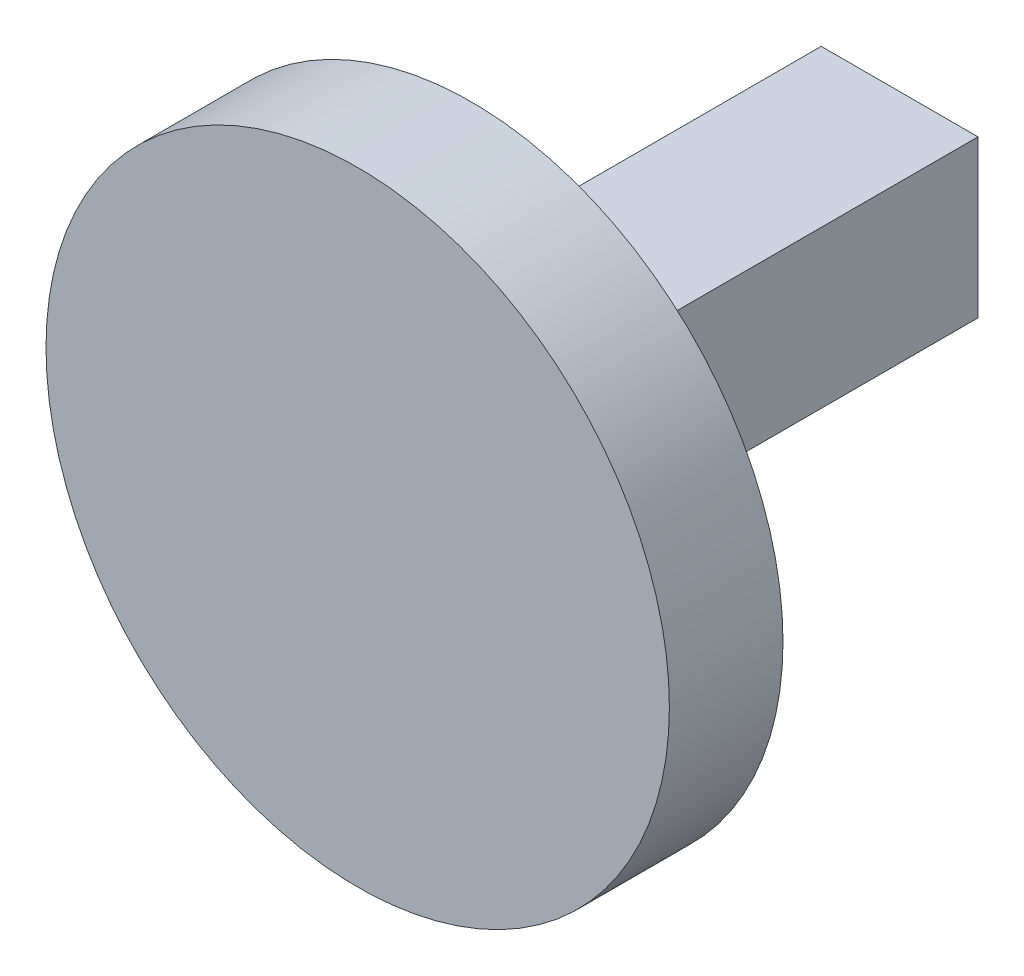
ISO-10303-21;
HEADER;
FILE_DESCRIPTION(('STEP AP214'),'2;1');
FILE_NAME('part.step','',(''),(''),'','','');
FILE_SCHEMA(('AUTOMOTIVE_DESIGN { 1 0 10303 214 1 1 1 1 }'));
ENDSEC;
DATA;
#1=APPLICATION_CONTEXT('core data for automotive mechanical design processes');
#2=APPLICATION_PROTOCOL_DEFINITION('international standard','automotive_design',2000,#1);
#3=PRODUCT_CONTEXT('',#1,'mechanical');
#4=PRODUCT('Part','Part','',(#3));
#5=PRODUCT_RELATED_PRODUCT_CATEGORY('part','',(#4));
#6=PRODUCT_DEFINITION_FORMATION('','',#4);
#7=PRODUCT_DEFINITION_CONTEXT('part definition',#1,'design');
#8=PRODUCT_DEFINITION('design','',#6,#7);
#9=PRODUCT_DEFINITION_SHAPE('','',#8);
#10=(LENGTH_UNIT() NAMED_UNIT(*) SI_UNIT(.MILLI.,.METRE.));
#11=(NAMED_UNIT(*) PLANE_ANGLE_UNIT() SI_UNIT($,.RADIAN.));
#12=(NAMED_UNIT(*) SI_UNIT($,.STERADIAN.) SOLID_ANGLE_UNIT());
#13=UNCERTAINTY_MEASURE_WITH_UNIT(LENGTH_MEASURE(1.E-05),#10,'distance_accuracy_value','');
#14=(GEOMETRIC_REPRESENTATION_CONTEXT(3) GLOBAL_UNCERTAINTY_ASSIGNED_CONTEXT((#13)) GLOBAL_UNIT_ASSIGNED_CONTEXT((#10,
#11,#12)) REPRESENTATION_CONTEXT('',''));
#15=CARTESIAN_POINT('',(0.,0.,0.));
#16=DIRECTION('',(0.,0.,1.));
#17=DIRECTION('',(1.,0.,0.));
#18=AXIS2_PLACEMENT_3D('',#15,#16,#17);
#19=CARTESIAN_POINT('',(1.1501285375014,-20.0813627796621,-10.));
#20=DIRECTION('',(0.,0.,1.));
#21=DIRECTION('',(1.,0.,0.));
#22=AXIS2_PLACEMENT_3D('',#19,#20,#21);
#23=PLANE('',#22);
#24=CARTESIAN_POINT('',(1.1501285375014,-20.0813627796621,-10.));
#25=DIRECTION('',(0.,0.,1.));
#26=DIRECTION('',(1.,0.,0.));
#27=AXIS2_PLACEMENT_3D('',#24,#25,#26);
#28=CIRCLE('',#27,13.7179279360244);
#29=CARTESIAN_POINT('',(14.8680564735258,-20.0813627796621,-10.));
#30=VERTEX_POINT('',#29);
#31=EDGE_CURVE('E11',#30,#30,#28,.T.);
#32=ORIENTED_EDGE('',*,*,#31,.F.);
#33=EDGE_LOOP('',(#32));
#34=FACE_BOUND('',#33,.T.);
#35=DIRECTION('',(0.,1.,0.));
#36=VECTOR('',#35,1.);
#37=CARTESIAN_POINT('',(-3.45,-16.55,-10.));
#38=LINE('',#37,#36);
#39=CARTESIAN_POINT('',(-3.45,-23.45,-10.));
#40=VERTEX_POINT('',#39);
#41=CARTESIAN_POINT('',(-3.45,-16.55,-10.));
#42=VERTEX_POINT('',#41);
#43=EDGE_CURVE('E50',#40,#42,#38,.T.);
#44=ORIENTED_EDGE('',*,*,#43,.F.);
#45=DIRECTION('',(-1.,0.,0.));
#46=VECTOR('',#45,1.);
#47=CARTESIAN_POINT('',(3.45,-23.45,-10.));
#48=LINE('',#47,#46);
#49=CARTESIAN_POINT('',(3.45,-23.45,-10.));
#50=VERTEX_POINT('',#49);
#51=EDGE_CURVE('E54',#50,#40,#48,.T.);
#52=ORIENTED_EDGE('',*,*,#51,.F.);
#53=DIRECTION('',(0.,-1.,0.));
#54=VECTOR('',#53,1.);
#55=CARTESIAN_POINT('',(3.45,-16.55,-10.));
#56=LINE('',#55,#54);
#57=CARTESIAN_POINT('',(3.45,-16.55,-10.));
#58=VERTEX_POINT('',#57);
#59=EDGE_CURVE('E106',#58,#50,#56,.T.);
#60=ORIENTED_EDGE('',*,*,#59,.F.);
#61=DIRECTION('',(1.,0.,0.));
#62=VECTOR('',#61,1.);
#63=CARTESIAN_POINT('',(3.45,-16.55,-10.));
#64=LINE('',#63,#62);
#65=EDGE_CURVE('E108',#42,#58,#64,.T.);
#66=ORIENTED_EDGE('',*,*,#65,.F.);
#67=EDGE_LOOP('',(#44,#52,#60,#66));
#68=FACE_BOUND('',#67,.T.);
#69=ADVANCED_FACE('F35',(#34,#68),#23,.F.);
#70=CARTESIAN_POINT('',(1.1501285375014,-20.0813627796621,-10.));
#71=DIRECTION('',(0.,0.,1.));
#72=DIRECTION('',(1.,0.,0.));
#73=AXIS2_PLACEMENT_3D('',#70,#71,#72);
#74=CYLINDRICAL_SURFACE('',#73,13.7179279360244);
#75=ORIENTED_EDGE('',*,*,#31,.T.);
#76=EDGE_LOOP('',(#75));
#77=FACE_BOUND('',#76,.T.);
#78=CARTESIAN_POINT('',(1.1501285375014,-20.0813627796621,-5.));
#79=DIRECTION('',(0.,0.,1.));
#80=DIRECTION('',(1.,0.,0.));
#81=AXIS2_PLACEMENT_3D('',#78,#79,#80);
#82=CIRCLE('',#81,13.7179279360244);
#83=CARTESIAN_POINT('',(14.8680564735258,-20.0813627796621,-5.));
#84=VERTEX_POINT('',#83);
#85=EDGE_CURVE('E39',#84,#84,#82,.T.);
#86=ORIENTED_EDGE('',*,*,#85,.F.);
#87=EDGE_LOOP('',(#86));
#88=FACE_BOUND('',#87,.T.);
#89=ADVANCED_FACE('F37',(#77,#88),#74,.T.);
#90=CARTESIAN_POINT('',(1.1501285375014,-20.0813627796621,-5.));
#91=DIRECTION('',(0.,0.,1.));
#92=DIRECTION('',(1.,0.,0.));
#93=AXIS2_PLACEMENT_3D('',#90,#91,#92);
#94=PLANE('',#93);
#95=ORIENTED_EDGE('',*,*,#85,.T.);
#96=EDGE_LOOP('',(#95));
#97=FACE_BOUND('',#96,.T.);
#98=ADVANCED_FACE('F131',(#97),#94,.T.);
#99=CARTESIAN_POINT('',(-3.45,-16.55,-30.));
#100=DIRECTION('',(1.,0.,0.));
#101=DIRECTION('',(0.,1.,0.));
#102=AXIS2_PLACEMENT_3D('',#99,#100,#101);
#103=PLANE('',#102);
#104=ORIENTED_EDGE('',*,*,#43,.T.);
#105=DIRECTION('',(0.,0.,1.));
#106=VECTOR('',#105,1.);
#107=CARTESIAN_POINT('',(-3.45,-16.55,-30.));
#108=LINE('',#107,#106);
#109=CARTESIAN_POINT('',(-3.45,-16.55,-30.));
#110=VERTEX_POINT('',#109);
#111=EDGE_CURVE('E79',#110,#42,#108,.T.);
#112=ORIENTED_EDGE('',*,*,#111,.F.);
#113=DIRECTION('',(0.,1.,0.));
#114=VECTOR('',#113,1.);
#115=CARTESIAN_POINT('',(-3.45,-16.55,-30.));
#116=LINE('',#115,#114);
#117=CARTESIAN_POINT('',(-3.45,-23.45,-30.));
#118=VERTEX_POINT('',#117);
#119=EDGE_CURVE('E85',#118,#110,#116,.T.);
#120=ORIENTED_EDGE('',*,*,#119,.F.);
#121=DIRECTION('',(0.,0.,1.));
#122=VECTOR('',#121,1.);
#123=CARTESIAN_POINT('',(-3.45,-23.45,-30.));
#124=LINE('',#123,#122);
#125=EDGE_CURVE('E103',#118,#40,#124,.T.);
#126=ORIENTED_EDGE('',*,*,#125,.T.);
#127=EDGE_LOOP('',(#104,#112,#120,#126));
#128=FACE_BOUND('',#127,.T.);
#129=ADVANCED_FACE('F95',(#128),#103,.F.);
#130=CARTESIAN_POINT('',(3.45,-16.55,-30.));
#131=DIRECTION('',(0.,-1.,0.));
#132=DIRECTION('',(0.,0.,-1.));
#133=AXIS2_PLACEMENT_3D('',#130,#131,#132);
#134=PLANE('',#133);
#135=ORIENTED_EDGE('',*,*,#65,.T.);
#136=DIRECTION('',(0.,0.,1.));
#137=VECTOR('',#136,1.);
#138=CARTESIAN_POINT('',(3.45,-16.55,-30.));
#139=LINE('',#138,#137);
#140=CARTESIAN_POINT('',(3.45,-16.55,-30.));
#141=VERTEX_POINT('',#140);
#142=EDGE_CURVE('E81',#141,#58,#139,.T.);
#143=ORIENTED_EDGE('',*,*,#142,.F.);
#144=DIRECTION('',(1.,0.,0.));
#145=VECTOR('',#144,1.);
#146=CARTESIAN_POINT('',(3.45,-16.55,-30.));
#147=LINE('',#146,#145);
#148=EDGE_CURVE('E74',#110,#141,#147,.T.);
#149=ORIENTED_EDGE('',*,*,#148,.F.);
#150=ORIENTED_EDGE('',*,*,#111,.T.);
#151=EDGE_LOOP('',(#135,#143,#149,#150));
#152=FACE_BOUND('',#151,.T.);
#153=ADVANCED_FACE('F77',(#152),#134,.F.);
#154=CARTESIAN_POINT('',(3.45,-16.55,-30.));
#155=DIRECTION('',(-1.,0.,0.));
#156=DIRECTION('',(0.,-1.,0.));
#157=AXIS2_PLACEMENT_3D('',#154,#155,#156);
#158=PLANE('',#157);
#159=ORIENTED_EDGE('',*,*,#59,.T.);
#160=DIRECTION('',(0.,0.,1.));
#161=VECTOR('',#160,1.);
#162=CARTESIAN_POINT('',(3.45,-23.45,-30.));
#163=LINE('',#162,#161);
#164=CARTESIAN_POINT('',(3.45,-23.45,-30.));
#165=VERTEX_POINT('',#164);
#166=EDGE_CURVE('E98',#165,#50,#163,.T.);
#167=ORIENTED_EDGE('',*,*,#166,.F.);
#168=DIRECTION('',(0.,-1.,0.));
#169=VECTOR('',#168,1.);
#170=CARTESIAN_POINT('',(3.45,-16.55,-30.));
#171=LINE('',#170,#169);
#172=EDGE_CURVE('E84',#141,#165,#171,.T.);
#173=ORIENTED_EDGE('',*,*,#172,.F.);
#174=ORIENTED_EDGE('',*,*,#142,.T.);
#175=EDGE_LOOP('',(#159,#167,#173,#174));
#176=FACE_BOUND('',#175,.T.);
#177=ADVANCED_FACE('F114',(#176),#158,.F.);
#178=CARTESIAN_POINT('',(3.45,-23.45,-30.));
#179=DIRECTION('',(0.,1.,0.));
#180=DIRECTION('',(0.,0.,1.));
#181=AXIS2_PLACEMENT_3D('',#178,#179,#180);
#182=PLANE('',#181);
#183=ORIENTED_EDGE('',*,*,#51,.T.);
#184=ORIENTED_EDGE('',*,*,#125,.F.);
#185=DIRECTION('',(-1.,0.,0.));
#186=VECTOR('',#185,1.);
#187=CARTESIAN_POINT('',(3.45,-23.45,-30.));
#188=LINE('',#187,#186);
#189=EDGE_CURVE('E90',#165,#118,#188,.T.);
#190=ORIENTED_EDGE('',*,*,#189,.F.);
#191=ORIENTED_EDGE('',*,*,#166,.T.);
#192=EDGE_LOOP('',(#183,#184,#190,#191));
#193=FACE_BOUND('',#192,.T.);
#194=ADVANCED_FACE('F116',(#193),#182,.F.);
#195=CARTESIAN_POINT('',(0.,0.,-30.));
#196=DIRECTION('',(0.,0.,-1.));
#197=DIRECTION('',(-1.,0.,0.));
#198=AXIS2_PLACEMENT_3D('',#195,#196,#197);
#199=PLANE('',#198);
#200=ORIENTED_EDGE('',*,*,#119,.T.);
#201=ORIENTED_EDGE('',*,*,#148,.T.);
#202=ORIENTED_EDGE('',*,*,#172,.T.);
#203=ORIENTED_EDGE('',*,*,#189,.T.);
#204=EDGE_LOOP('',(#200,#201,#202,#203));
#205=FACE_BOUND('',#204,.T.);
#206=ADVANCED_FACE('F88',(#205),#199,.T.);
#207=CLOSED_SHELL('',(#69,#89,#98,#129,#153,#177,#194,#206));
#208=MANIFOLD_SOLID_BREP('B2',#207);
#209=ADVANCED_BREP_SHAPE_REPRESENTATION('',(#18,#208),#14);
#210=SHAPE_DEFINITION_REPRESENTATION(#9,#209);
ENDSEC;
END-ISO-10303-21;
